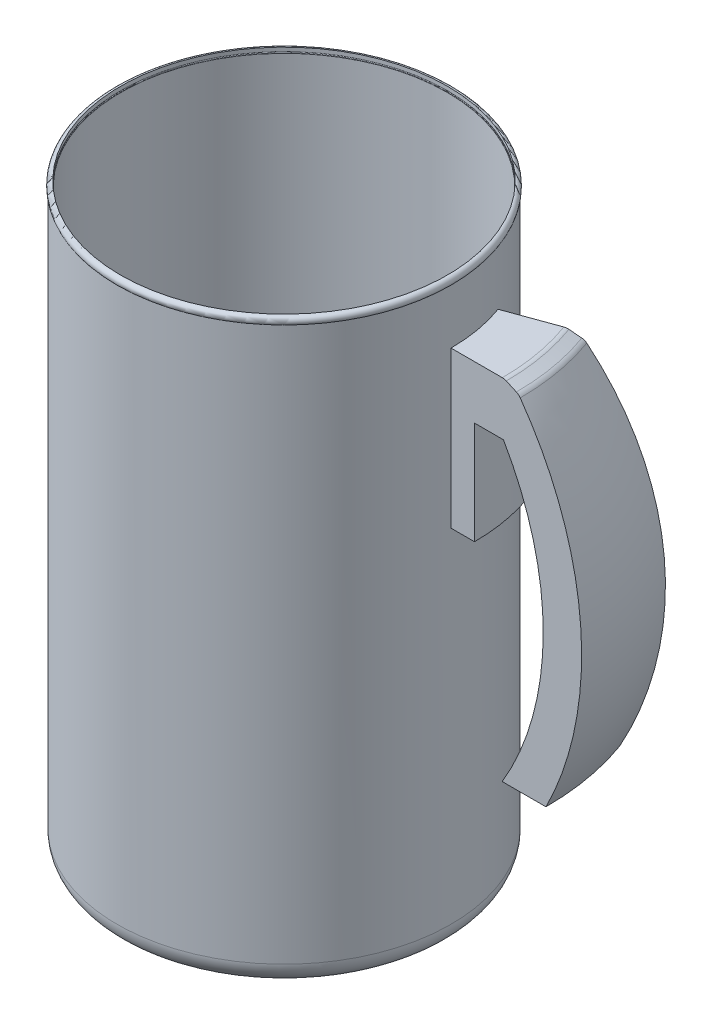
ISO-10303-21;
HEADER;
FILE_DESCRIPTION(('STEP AP214'),'2;1');
FILE_NAME('part.step','',(''),(''),'','','');
FILE_SCHEMA(('AUTOMOTIVE_DESIGN { 1 0 10303 214 1 1 1 1 }'));
ENDSEC;
DATA;
#1=APPLICATION_CONTEXT('core data for automotive mechanical design processes');
#2=APPLICATION_PROTOCOL_DEFINITION('international standard','automotive_design',2000,#1);
#3=PRODUCT_CONTEXT('',#1,'mechanical');
#4=PRODUCT('Part','Part','',(#3));
#5=PRODUCT_RELATED_PRODUCT_CATEGORY('part','',(#4));
#6=PRODUCT_DEFINITION_FORMATION('','',#4);
#7=PRODUCT_DEFINITION_CONTEXT('part definition',#1,'design');
#8=PRODUCT_DEFINITION('design','',#6,#7);
#9=PRODUCT_DEFINITION_SHAPE('','',#8);
#10=(LENGTH_UNIT() NAMED_UNIT(*) SI_UNIT(.MILLI.,.METRE.));
#11=(NAMED_UNIT(*) PLANE_ANGLE_UNIT() SI_UNIT($,.RADIAN.));
#12=(NAMED_UNIT(*) SI_UNIT($,.STERADIAN.) SOLID_ANGLE_UNIT());
#13=UNCERTAINTY_MEASURE_WITH_UNIT(LENGTH_MEASURE(1.E-05),#10,'distance_accuracy_value','');
#14=(GEOMETRIC_REPRESENTATION_CONTEXT(3) GLOBAL_UNCERTAINTY_ASSIGNED_CONTEXT((#13)) GLOBAL_UNIT_ASSIGNED_CONTEXT((#10,
#11,#12)) REPRESENTATION_CONTEXT('',''));
#15=CARTESIAN_POINT('',(0.,0.,0.));
#16=DIRECTION('',(0.,0.,1.));
#17=DIRECTION('',(1.,0.,0.));
#18=AXIS2_PLACEMENT_3D('',#15,#16,#17);
#19=CARTESIAN_POINT('',(0.,315.190892731946,0.));
#20=DIRECTION('',(0.,-1.,0.));
#21=DIRECTION('',(0.,0.,-1.));
#22=AXIS2_PLACEMENT_3D('',#19,#20,#21);
#23=CYLINDRICAL_SURFACE('',#22,85.1843540851687);
#24=CARTESIAN_POINT('',(0.,315.190892731946,0.));
#25=DIRECTION('',(0.,-1.,0.));
#26=DIRECTION('',(0.,0.,-1.));
#27=AXIS2_PLACEMENT_3D('',#24,#25,#26);
#28=CIRCLE('',#27,85.1843540851687);
#29=CARTESIAN_POINT('',(0.,315.190892731946,-85.1843540851687));
#30=VERTEX_POINT('',#29);
#31=EDGE_CURVE('E227',#30,#30,#28,.T.);
#32=ORIENTED_EDGE('',*,*,#31,.T.);
#33=EDGE_LOOP('',(#32));
#34=FACE_BOUND('',#33,.T.);
#35=CARTESIAN_POINT('',(0.,317.190892731946,0.));
#36=DIRECTION('',(0.,-1.,0.));
#37=DIRECTION('',(0.,0.,-1.));
#38=AXIS2_PLACEMENT_3D('',#35,#36,#37);
#39=CIRCLE('',#38,85.1843540851687);
#40=CARTESIAN_POINT('',(0.,317.190892731946,-85.1843540851687));
#41=VERTEX_POINT('',#40);
#42=EDGE_CURVE('E11',#41,#41,#39,.T.);
#43=ORIENTED_EDGE('',*,*,#42,.F.);
#44=EDGE_LOOP('',(#43));
#45=FACE_BOUND('',#44,.T.);
#46=ADVANCED_FACE('F38',(#34,#45),#23,.F.);
#47=CARTESIAN_POINT('',(0.,314.918573492151,0.));
#48=DIRECTION('',(0.,-1.,0.));
#49=DIRECTION('',(0.,0.,-1.));
#50=AXIS2_PLACEMENT_3D('',#47,#48,#49);
#51=TOROIDAL_SURFACE('',#50,85.1843540851687,2.27231923979454);
#52=CARTESIAN_POINT('',(0.,313.552240941307,0.));
#53=DIRECTION('',(0.,1.,0.));
#54=DIRECTION('',(0.,0.,1.));
#55=AXIS2_PLACEMENT_3D('',#52,#53,#54);
#56=CIRCLE('',#55,87.);
#57=CARTESIAN_POINT('',(0.,313.552240941307,87.));
#58=VERTEX_POINT('',#57);
#59=EDGE_CURVE('E42',#58,#58,#56,.F.);
#60=ORIENTED_EDGE('',*,*,#59,.F.);
#61=EDGE_LOOP('',(#60));
#62=FACE_BOUND('',#61,.T.);
#63=ORIENTED_EDGE('',*,*,#42,.T.);
#64=EDGE_LOOP('',(#63));
#65=FACE_BOUND('',#64,.T.);
#66=ADVANCED_FACE('F244',(#62,#65),#51,.T.);
#67=CARTESIAN_POINT('',(0.,15.1908927319458,0.));
#68=DIRECTION('',(0.,-1.,0.));
#69=DIRECTION('',(0.,0.,-1.));
#70=AXIS2_PLACEMENT_3D('',#67,#68,#69);
#71=CYLINDRICAL_SURFACE('',#70,87.);
#72=CARTESIAN_POINT('',(0.,285.165847721299,0.));
#73=DIRECTION('',(0.,-1.,0.));
#74=DIRECTION('',(0.,0.,-1.));
#75=AXIS2_PLACEMENT_3D('',#72,#73,#74);
#76=CIRCLE('',#75,87.);
#77=CARTESIAN_POINT('',(81.753258008374,285.165847721299,-29.7557524693332));
#78=VERTEX_POINT('',#77);
#79=CARTESIAN_POINT('',(87.,285.165847721299,0.));
#80=VERTEX_POINT('',#79);
#81=EDGE_CURVE('E53',#78,#80,#76,.T.);
#82=ORIENTED_EDGE('',*,*,#81,.F.);
#83=DIRECTION('',(0.,-1.,0.));
#84=VECTOR('',#83,1.);
#85=CARTESIAN_POINT('',(81.753258008374,285.165847721299,-29.7557524693332));
#86=LINE('',#85,#84);
#87=CARTESIAN_POINT('',(81.753258008374,203.913989011912,-29.7557524693332));
#88=VERTEX_POINT('',#87);
#89=EDGE_CURVE('E58',#78,#88,#86,.T.);
#90=ORIENTED_EDGE('',*,*,#89,.T.);
#91=CARTESIAN_POINT('',(0.,203.913989011912,0.));
#92=DIRECTION('',(0.,-1.,0.));
#93=DIRECTION('',(0.,0.,-1.));
#94=AXIS2_PLACEMENT_3D('',#91,#92,#93);
#95=CIRCLE('',#94,87.);
#96=CARTESIAN_POINT('',(87.,203.913989011912,0.));
#97=VERTEX_POINT('',#96);
#98=EDGE_CURVE('E117',#88,#97,#95,.T.);
#99=ORIENTED_EDGE('',*,*,#98,.T.);
#100=DIRECTION('',(0.,-1.,0.));
#101=VECTOR('',#100,1.);
#102=CARTESIAN_POINT('',(87.,285.165847721299,0.));
#103=LINE('',#102,#101);
#104=EDGE_CURVE('E122',#80,#97,#103,.T.);
#105=ORIENTED_EDGE('',*,*,#104,.F.);
#106=EDGE_LOOP('',(#82,#90,#99,#105));
#107=FACE_BOUND('',#106,.T.);
#108=CARTESIAN_POINT('',(0.,25.190892731946,0.));
#109=DIRECTION('',(0.,-1.,0.));
#110=DIRECTION('',(0.,0.,-1.));
#111=AXIS2_PLACEMENT_3D('',#108,#109,#110);
#112=CIRCLE('',#111,87.);
#113=CARTESIAN_POINT('',(0.,25.190892731946,-87.));
#114=VERTEX_POINT('',#113);
#115=EDGE_CURVE('E231',#114,#114,#112,.T.);
#116=ORIENTED_EDGE('',*,*,#115,.F.);
#117=EDGE_LOOP('',(#116));
#118=FACE_BOUND('',#117,.T.);
#119=ORIENTED_EDGE('',*,*,#59,.T.);
#120=EDGE_LOOP('',(#119));
#121=FACE_BOUND('',#120,.T.);
#122=ADVANCED_FACE('F119',(#107,#118,#121),#71,.T.);
#123=CARTESIAN_POINT('',(0.,25.190892731946,0.));
#124=DIRECTION('',(0.,-1.,0.));
#125=DIRECTION('',(0.,0.,-1.));
#126=AXIS2_PLACEMENT_3D('',#123,#124,#125);
#127=TOROIDAL_SURFACE('',#126,75.,12.);
#128=CARTESIAN_POINT('',(0.,13.190892731946,0.));
#129=DIRECTION('',(0.,-1.,0.));
#130=DIRECTION('',(0.,0.,-1.));
#131=AXIS2_PLACEMENT_3D('',#128,#129,#130);
#132=CIRCLE('',#131,75.);
#133=CARTESIAN_POINT('',(0.,13.190892731946,-75.));
#134=VERTEX_POINT('',#133);
#135=EDGE_CURVE('E230',#134,#134,#132,.T.);
#136=ORIENTED_EDGE('',*,*,#135,.F.);
#137=EDGE_LOOP('',(#136));
#138=FACE_BOUND('',#137,.T.);
#139=ORIENTED_EDGE('',*,*,#115,.T.);
#140=EDGE_LOOP('',(#139));
#141=FACE_BOUND('',#140,.T.);
#142=ADVANCED_FACE('F238',(#138,#141),#127,.T.);
#143=CARTESIAN_POINT('',(0.,13.1908927319459,0.));
#144=DIRECTION('',(0.,1.,0.));
#145=DIRECTION('',(0.,0.,1.));
#146=AXIS2_PLACEMENT_3D('',#143,#144,#145);
#147=PLANE('',#146);
#148=ORIENTED_EDGE('',*,*,#135,.T.);
#149=EDGE_LOOP('',(#148));
#150=FACE_BOUND('',#149,.T.);
#151=ADVANCED_FACE('F40',(#150),#147,.F.);
#152=CARTESIAN_POINT('',(0.,314.918573492151,0.));
#153=DIRECTION('',(0.,-1.,0.));
#154=DIRECTION('',(0.,0.,-1.));
#155=AXIS2_PLACEMENT_3D('',#152,#153,#154);
#156=TOROIDAL_SURFACE('',#155,85.1843540851687,0.272319239794538);
#157=CARTESIAN_POINT('',(0.,314.646254252357,0.));
#158=DIRECTION('',(0.,-1.,0.));
#159=DIRECTION('',(0.,0.,-1.));
#160=AXIS2_PLACEMENT_3D('',#157,#158,#159);
#161=CIRCLE('',#160,85.1843540851687);
#162=CARTESIAN_POINT('',(0.,314.646254252357,-85.1843540851687));
#163=VERTEX_POINT('',#162);
#164=EDGE_CURVE('E224',#163,#163,#161,.T.);
#165=ORIENTED_EDGE('',*,*,#164,.T.);
#166=EDGE_LOOP('',(#165));
#167=FACE_BOUND('',#166,.T.);
#168=ORIENTED_EDGE('',*,*,#31,.F.);
#169=EDGE_LOOP('',(#168));
#170=FACE_BOUND('',#169,.T.);
#171=ADVANCED_FACE('F260',(#167,#170),#156,.F.);
#172=CARTESIAN_POINT('',(-85.1655022737581,314.646254252357,0.));
#173=DIRECTION('',(0.,1.,0.));
#174=DIRECTION('',(0.,0.,1.));
#175=AXIS2_PLACEMENT_3D('',#172,#173,#174);
#176=PLANE('',#175);
#177=CARTESIAN_POINT('',(0.,314.646254252357,0.));
#178=DIRECTION('',(0.,-1.,0.));
#179=DIRECTION('',(0.,0.,-1.));
#180=AXIS2_PLACEMENT_3D('',#177,#178,#179);
#181=CIRCLE('',#180,85.1655022737581);
#182=CARTESIAN_POINT('',(0.,314.646254252357,-85.1655022737581));
#183=VERTEX_POINT('',#182);
#184=EDGE_CURVE('E221',#183,#183,#181,.T.);
#185=ORIENTED_EDGE('',*,*,#184,.T.);
#186=EDGE_LOOP('',(#185));
#187=FACE_BOUND('',#186,.T.);
#188=ORIENTED_EDGE('',*,*,#164,.F.);
#189=EDGE_LOOP('',(#188));
#190=FACE_BOUND('',#189,.T.);
#191=ADVANCED_FACE('F263',(#187,#190),#176,.T.);
#192=CARTESIAN_POINT('',(0.,314.480751978599,0.));
#193=DIRECTION('',(0.,-1.,0.));
#194=DIRECTION('',(0.,0.,-1.));
#195=AXIS2_PLACEMENT_3D('',#192,#193,#194);
#196=TOROIDAL_SURFACE('',#195,85.1655022737581,0.165502273758049);
#197=CARTESIAN_POINT('',(0.,314.480751978599,0.));
#198=DIRECTION('',(0.,-1.,0.));
#199=DIRECTION('',(0.,0.,-1.));
#200=AXIS2_PLACEMENT_3D('',#197,#198,#199);
#201=CIRCLE('',#200,85.);
#202=CARTESIAN_POINT('',(0.,314.480751978599,-85.));
#203=VERTEX_POINT('',#202);
#204=EDGE_CURVE('E218',#203,#203,#201,.T.);
#205=ORIENTED_EDGE('',*,*,#204,.T.);
#206=EDGE_LOOP('',(#205));
#207=FACE_BOUND('',#206,.T.);
#208=ORIENTED_EDGE('',*,*,#184,.F.);
#209=EDGE_LOOP('',(#208));
#210=FACE_BOUND('',#209,.T.);
#211=ADVANCED_FACE('F267',(#207,#210),#196,.T.);
#212=CARTESIAN_POINT('',(0.,15.1908927319458,0.));
#213=DIRECTION('',(0.,-1.,0.));
#214=DIRECTION('',(0.,0.,-1.));
#215=AXIS2_PLACEMENT_3D('',#212,#213,#214);
#216=CYLINDRICAL_SURFACE('',#215,85.);
#217=CARTESIAN_POINT('',(0.,25.190892731946,0.));
#218=DIRECTION('',(0.,-1.,0.));
#219=DIRECTION('',(0.,0.,-1.));
#220=AXIS2_PLACEMENT_3D('',#217,#218,#219);
#221=CIRCLE('',#220,85.);
#222=CARTESIAN_POINT('',(0.,25.190892731946,-85.));
#223=VERTEX_POINT('',#222);
#224=EDGE_CURVE('E215',#223,#223,#221,.T.);
#225=ORIENTED_EDGE('',*,*,#224,.T.);
#226=EDGE_LOOP('',(#225));
#227=FACE_BOUND('',#226,.T.);
#228=ORIENTED_EDGE('',*,*,#204,.F.);
#229=EDGE_LOOP('',(#228));
#230=FACE_BOUND('',#229,.T.);
#231=ADVANCED_FACE('F271',(#227,#230),#216,.F.);
#232=CARTESIAN_POINT('',(0.,25.190892731946,0.));
#233=DIRECTION('',(0.,-1.,0.));
#234=DIRECTION('',(0.,0.,-1.));
#235=AXIS2_PLACEMENT_3D('',#232,#233,#234);
#236=TOROIDAL_SURFACE('',#235,75.,10.);
#237=CARTESIAN_POINT('',(0.,15.190892731946,0.));
#238=DIRECTION('',(0.,-1.,0.));
#239=DIRECTION('',(0.,0.,-1.));
#240=AXIS2_PLACEMENT_3D('',#237,#238,#239);
#241=CIRCLE('',#240,75.);
#242=CARTESIAN_POINT('',(0.,15.190892731946,-75.));
#243=VERTEX_POINT('',#242);
#244=EDGE_CURVE('E212',#243,#243,#241,.T.);
#245=ORIENTED_EDGE('',*,*,#244,.T.);
#246=EDGE_LOOP('',(#245));
#247=FACE_BOUND('',#246,.T.);
#248=ORIENTED_EDGE('',*,*,#224,.F.);
#249=EDGE_LOOP('',(#248));
#250=FACE_BOUND('',#249,.T.);
#251=ADVANCED_FACE('F275',(#247,#250),#236,.F.);
#252=CARTESIAN_POINT('',(0.,15.1908927319459,0.));
#253=DIRECTION('',(0.,1.,0.));
#254=DIRECTION('',(0.,0.,1.));
#255=AXIS2_PLACEMENT_3D('',#252,#253,#254);
#256=PLANE('',#255);
#257=ORIENTED_EDGE('',*,*,#244,.F.);
#258=EDGE_LOOP('',(#257));
#259=FACE_BOUND('',#258,.T.);
#260=ADVANCED_FACE('F279',(#259),#256,.T.);
#261=CARTESIAN_POINT('',(81.753258008374,285.165847721299,-29.7557524693332));
#262=DIRECTION('',(0.,1.,0.));
#263=DIRECTION('',(0.,0.,1.));
#264=AXIS2_PLACEMENT_3D('',#261,#262,#263);
#265=PLANE('',#264);
#266=CARTESIAN_POINT('',(0.,285.165847721299,0.));
#267=DIRECTION('',(0.,-1.,0.));
#268=DIRECTION('',(0.,0.,-1.));
#269=AXIS2_PLACEMENT_3D('',#266,#267,#268);
#270=CIRCLE('',#269,113.741198074737);
#271=CARTESIAN_POINT('',(106.881764510179,285.165847721299,-38.9017808675549));
#272=VERTEX_POINT('',#271);
#273=CARTESIAN_POINT('',(113.741198074737,285.165847721299,0.));
#274=VERTEX_POINT('',#273);
#275=EDGE_CURVE('E209',#272,#274,#270,.T.);
#276=ORIENTED_EDGE('',*,*,#275,.F.);
#277=DIRECTION('',(-0.939692620785908,0.,0.342020143325669));
#278=VECTOR('',#277,1.);
#279=CARTESIAN_POINT('',(81.753258008374,285.165847721299,-29.7557524693332));
#280=LINE('',#279,#278);
#281=EDGE_CURVE('E127',#272,#78,#280,.T.);
#282=ORIENTED_EDGE('',*,*,#281,.T.);
#283=ORIENTED_EDGE('',*,*,#81,.T.);
#284=DIRECTION('',(-1.,0.,0.));
#285=VECTOR('',#284,1.);
#286=CARTESIAN_POINT('',(87.,285.165847721299,0.));
#287=LINE('',#286,#285);
#288=EDGE_CURVE('E141',#274,#80,#287,.T.);
#289=ORIENTED_EDGE('',*,*,#288,.F.);
#290=EDGE_LOOP('',(#276,#282,#283,#289));
#291=FACE_BOUND('',#290,.T.);
#292=ADVANCED_FACE('F283',(#291),#265,.T.);
#293=CARTESIAN_POINT('',(0.,280.165847721299,0.));
#294=DIRECTION('',(0.,-1.,0.));
#295=DIRECTION('',(0.,0.,-1.));
#296=AXIS2_PLACEMENT_3D('',#293,#294,#295);
#297=TOROIDAL_SURFACE('',#296,113.741198074737,5.00000000000001);
#298=CARTESIAN_POINT('',(0.,284.725455247174,0.));
#299=DIRECTION('',(0.,-1.,0.));
#300=DIRECTION('',(0.,0.,-1.));
#301=AXIS2_PLACEMENT_3D('',#298,#299,#300);
#302=CIRCLE('',#301,115.793021461381);
#303=CARTESIAN_POINT('',(108.809847805764,284.725455247174,-39.6035457963338));
#304=VERTEX_POINT('',#303);
#305=CARTESIAN_POINT('',(115.793021461381,284.725455247174,0.));
#306=VERTEX_POINT('',#305);
#307=EDGE_CURVE('E207',#304,#306,#302,.T.);
#308=ORIENTED_EDGE('',*,*,#307,.F.);
#309=CARTESIAN_POINT('',(106.881764510179,280.165847721299,-38.9017808675549));
#310=DIRECTION('',(0.342020143325669,0.,0.939692620785908));
#311=DIRECTION('',(0.939692620785908,0.,-0.342020143325669));
#312=AXIS2_PLACEMENT_3D('',#309,#310,#311);
#313=CIRCLE('',#312,5.00000000000001);
#314=EDGE_CURVE('E190',#304,#272,#313,.T.);
#315=ORIENTED_EDGE('',*,*,#314,.T.);
#316=ORIENTED_EDGE('',*,*,#275,.T.);
#317=CARTESIAN_POINT('',(113.741198074737,280.165847721299,0.));
#318=DIRECTION('',(0.,0.,1.));
#319=DIRECTION('',(1.,0.,0.));
#320=AXIS2_PLACEMENT_3D('',#317,#318,#319);
#321=CIRCLE('',#320,5.00000000000001);
#322=EDGE_CURVE('E163',#306,#274,#321,.T.);
#323=ORIENTED_EDGE('',*,*,#322,.F.);
#324=EDGE_LOOP('',(#308,#315,#316,#323));
#325=FACE_BOUND('',#324,.T.);
#326=ADVANCED_FACE('F287',(#325),#297,.T.);
#327=CARTESIAN_POINT('',(0.,282.366052011893,0.));
#328=DIRECTION('',(0.,-1.,0.));
#329=DIRECTION('',(0.,0.,-1.));
#330=AXIS2_PLACEMENT_3D('',#327,#328,#329);
#331=CONICAL_SURFACE('',#330,121.036139762005,1.14794240066195);
#332=CARTESIAN_POINT('',(0.,282.366052011893,0.));
#333=DIRECTION('',(0.,-1.,0.));
#334=DIRECTION('',(0.,0.,-1.));
#335=AXIS2_PLACEMENT_3D('',#332,#333,#334);
#336=CIRCLE('',#335,121.036139762005);
#337=CARTESIAN_POINT('',(113.736767382768,282.366052011893,-41.3967978689867));
#338=VERTEX_POINT('',#337);
#339=CARTESIAN_POINT('',(121.036139762005,282.366052011893,0.));
#340=VERTEX_POINT('',#339);
#341=EDGE_CURVE('E205',#338,#340,#336,.T.);
#342=ORIENTED_EDGE('',*,*,#341,.F.);
#343=DIRECTION('',(-0.856925909149023,0.410364677328803,0.311895523901749));
#344=VECTOR('',#343,1.);
#345=CARTESIAN_POINT('',(108.809847805764,284.725455247174,-39.6035457963338));
#346=LINE('',#345,#344);
#347=EDGE_CURVE('E187',#338,#304,#346,.T.);
#348=ORIENTED_EDGE('',*,*,#347,.T.);
#349=ORIENTED_EDGE('',*,*,#307,.T.);
#350=DIRECTION('',(-0.911921505175104,0.410364677328803,0.));
#351=VECTOR('',#350,1.);
#352=CARTESIAN_POINT('',(115.793021461381,284.725455247174,0.));
#353=LINE('',#352,#351);
#354=EDGE_CURVE('E160',#340,#306,#353,.T.);
#355=ORIENTED_EDGE('',*,*,#354,.F.);
#356=EDGE_LOOP('',(#342,#348,#349,#355));
#357=FACE_BOUND('',#356,.T.);
#358=ADVANCED_FACE('F291',(#357),#331,.T.);
#359=CARTESIAN_POINT('',(0.,277.806444486018,0.));
#360=DIRECTION('',(0.,-1.,0.));
#361=DIRECTION('',(0.,0.,-1.));
#362=AXIS2_PLACEMENT_3D('',#359,#360,#361);
#363=TOROIDAL_SURFACE('',#362,118.984316375361,5.00000000000002);
#364=CARTESIAN_POINT('',(0.,280.707686559381,0.));
#365=DIRECTION('',(0.,-1.,0.));
#366=DIRECTION('',(0.,0.,-1.));
#367=AXIS2_PLACEMENT_3D('',#364,#365,#366);
#368=CIRCLE('',#367,123.056514115126);
#369=CARTESIAN_POINT('',(115.635298253621,280.707686559381,-42.0878065948126));
#370=VERTEX_POINT('',#369);
#371=CARTESIAN_POINT('',(123.056514115126,280.707686559381,0.));
#372=VERTEX_POINT('',#371);
#373=EDGE_CURVE('E203',#370,#372,#368,.T.);
#374=ORIENTED_EDGE('',*,*,#373,.F.);
#375=CARTESIAN_POINT('',(111.808684087183,277.806444486018,-40.6950329402078));
#376=DIRECTION('',(0.342020143325669,0.,0.939692620785908));
#377=DIRECTION('',(0.939692620785908,0.,-0.342020143325669));
#378=AXIS2_PLACEMENT_3D('',#375,#376,#377);
#379=CIRCLE('',#378,5.00000000000002);
#380=EDGE_CURVE('E184',#370,#338,#379,.T.);
#381=ORIENTED_EDGE('',*,*,#380,.T.);
#382=ORIENTED_EDGE('',*,*,#341,.T.);
#383=CARTESIAN_POINT('',(118.984316375361,277.806444486018,0.));
#384=DIRECTION('',(0.,0.,1.));
#385=DIRECTION('',(1.,0.,0.));
#386=AXIS2_PLACEMENT_3D('',#383,#384,#385);
#387=CIRCLE('',#386,5.00000000000002);
#388=EDGE_CURVE('E157',#372,#340,#387,.T.);
#389=ORIENTED_EDGE('',*,*,#388,.F.);
#390=EDGE_LOOP('',(#374,#381,#382,#389));
#391=FACE_BOUND('',#390,.T.);
#392=ADVANCED_FACE('F295',(#391),#363,.T.);
#393=CARTESIAN_POINT('',(0.,180.730675604851,0.));
#394=DIRECTION('',(0.,-1.,0.));
#395=DIRECTION('',(0.,0.,-1.));
#396=AXIS2_PLACEMENT_3D('',#393,#394,#395);
#397=DEGENERATE_TOROIDAL_SURFACE('',#396,17.2717134999778,172.300360373966,.F.);
#398=CARTESIAN_POINT('',(0.,102.926705840701,0.));
#399=DIRECTION('',(0.,-1.,0.));
#400=DIRECTION('',(0.,0.,-1.));
#401=AXIS2_PLACEMENT_3D('',#398,#399,#400);
#402=CIRCLE('',#401,136.461680640456);
#403=CARTESIAN_POINT('',(128.23203431788,102.926705840701,-46.6726435711105));
#404=VERTEX_POINT('',#403);
#405=CARTESIAN_POINT('',(136.461680640456,102.926705840701,0.));
#406=VERTEX_POINT('',#405);
#407=EDGE_CURVE('E201',#404,#406,#402,.T.);
#408=ORIENTED_EDGE('',*,*,#407,.F.);
#409=CARTESIAN_POINT('',(-16.2301017242575,180.730675604851,5.90727392674232));
#410=DIRECTION('',(0.342020143325669,0.,0.939692620785908));
#411=DIRECTION('',(-0.939692620785908,0.,0.342020143325669));
#412=AXIS2_PLACEMENT_3D('',#409,#410,#411);
#413=CIRCLE('',#412,172.300360373966);
#414=EDGE_CURVE('E181',#404,#370,#413,.T.);
#415=ORIENTED_EDGE('',*,*,#414,.T.);
#416=ORIENTED_EDGE('',*,*,#373,.T.);
#417=CARTESIAN_POINT('',(-17.2717134999778,180.730675604851,0.));
#418=DIRECTION('',(0.,0.,1.));
#419=DIRECTION('',(-1.,0.,0.));
#420=AXIS2_PLACEMENT_3D('',#417,#418,#419);
#421=CIRCLE('',#420,172.300360373966);
#422=EDGE_CURVE('E154',#406,#372,#421,.T.);
#423=ORIENTED_EDGE('',*,*,#422,.F.);
#424=EDGE_LOOP('',(#408,#415,#416,#423));
#425=FACE_BOUND('',#424,.T.);
#426=ADVANCED_FACE('F299',(#425),#397,.F.);
#427=CARTESIAN_POINT('',(106.801259150781,102.926705840701,-38.8724793130353));
#428=DIRECTION('',(0.,-1.,0.));
#429=DIRECTION('',(0.,0.,-1.));
#430=AXIS2_PLACEMENT_3D('',#427,#428,#429);
#431=PLANE('',#430);
#432=CARTESIAN_POINT('',(0.,102.926705840701,0.));
#433=DIRECTION('',(0.,-1.,0.));
#434=DIRECTION('',(0.,0.,-1.));
#435=AXIS2_PLACEMENT_3D('',#432,#433,#434);
#436=CIRCLE('',#435,113.655526060701);
#437=CARTESIAN_POINT('',(106.801259150781,102.926705840701,-38.8724793130353));
#438=VERTEX_POINT('',#437);
#439=CARTESIAN_POINT('',(113.655526060701,102.926705840701,0.));
#440=VERTEX_POINT('',#439);
#441=EDGE_CURVE('E199',#438,#440,#436,.T.);
#442=ORIENTED_EDGE('',*,*,#441,.F.);
#443=DIRECTION('',(0.939692620785908,0.,-0.342020143325669));
#444=VECTOR('',#443,1.);
#445=CARTESIAN_POINT('',(106.801259150781,102.926705840701,-38.8724793130353));
#446=LINE('',#445,#444);
#447=EDGE_CURVE('E178',#438,#404,#446,.T.);
#448=ORIENTED_EDGE('',*,*,#447,.T.);
#449=ORIENTED_EDGE('',*,*,#407,.T.);
#450=DIRECTION('',(1.,0.,0.));
#451=VECTOR('',#450,1.);
#452=CARTESIAN_POINT('',(113.655526060701,102.926705840701,0.));
#453=LINE('',#452,#451);
#454=EDGE_CURVE('E151',#440,#406,#453,.T.);
#455=ORIENTED_EDGE('',*,*,#454,.F.);
#456=EDGE_LOOP('',(#442,#448,#449,#455));
#457=FACE_BOUND('',#456,.T.);
#458=ADVANCED_FACE('F303',(#457),#431,.T.);
#459=CARTESIAN_POINT('',(0.,180.730675604851,0.));
#460=DIRECTION('',(0.,-1.,0.));
#461=DIRECTION('',(0.,0.,-1.));
#462=AXIS2_PLACEMENT_3D('',#459,#460,#461);
#463=DEGENERATE_TOROIDAL_SURFACE('',#462,17.2717134999778,152.300360373966,.F.);
#464=CARTESIAN_POINT('',(0.,257.446753496334,0.));
#465=DIRECTION('',(0.,-1.,0.));
#466=DIRECTION('',(0.,0.,-1.));
#467=AXIS2_PLACEMENT_3D('',#464,#465,#466);
#468=CIRCLE('',#467,114.295923717493);
#469=CARTESIAN_POINT('',(107.403036103237,257.446753496334,-39.0915082113966));
#470=VERTEX_POINT('',#469);
#471=CARTESIAN_POINT('',(114.295923717493,257.446753496334,0.));
#472=VERTEX_POINT('',#471);
#473=EDGE_CURVE('E197',#470,#472,#468,.T.);
#474=ORIENTED_EDGE('',*,*,#473,.F.);
#475=CARTESIAN_POINT('',(-16.2301017242575,180.730675604851,5.90727392674232));
#476=DIRECTION('',(-0.342020143325669,0.,-0.939692620785908));
#477=DIRECTION('',(-0.939692620785908,0.,0.342020143325669));
#478=AXIS2_PLACEMENT_3D('',#475,#476,#477);
#479=CIRCLE('',#478,152.300360373966);
#480=EDGE_CURVE('E175',#470,#438,#479,.T.);
#481=ORIENTED_EDGE('',*,*,#480,.T.);
#482=ORIENTED_EDGE('',*,*,#441,.T.);
#483=CARTESIAN_POINT('',(-17.2717134999778,180.730675604851,0.));
#484=DIRECTION('',(0.,0.,-1.));
#485=DIRECTION('',(-1.,0.,0.));
#486=AXIS2_PLACEMENT_3D('',#483,#484,#485);
#487=CIRCLE('',#486,152.300360373966);
#488=EDGE_CURVE('E148',#472,#440,#487,.T.);
#489=ORIENTED_EDGE('',*,*,#488,.F.);
#490=EDGE_LOOP('',(#474,#481,#482,#489));
#491=FACE_BOUND('',#490,.T.);
#492=ADVANCED_FACE('F307',(#491),#463,.T.);
#493=CARTESIAN_POINT('',(93.2437575599317,257.446753496334,-33.9379522829494));
#494=DIRECTION('',(0.,-1.,0.));
#495=DIRECTION('',(0.,0.,-1.));
#496=AXIS2_PLACEMENT_3D('',#493,#494,#495);
#497=PLANE('',#496);
#498=CARTESIAN_POINT('',(0.,257.446753496334,0.));
#499=DIRECTION('',(0.,-1.,0.));
#500=DIRECTION('',(0.,0.,-1.));
#501=AXIS2_PLACEMENT_3D('',#498,#499,#500);
#502=CIRCLE('',#501,99.2279342174122);
#503=CARTESIAN_POINT('',(93.2437575599317,257.446753496334,-33.9379522829494));
#504=VERTEX_POINT('',#503);
#505=CARTESIAN_POINT('',(99.2279342174122,257.446753496334,0.));
#506=VERTEX_POINT('',#505);
#507=EDGE_CURVE('E195',#504,#506,#502,.T.);
#508=ORIENTED_EDGE('',*,*,#507,.F.);
#509=DIRECTION('',(0.939692620785908,0.,-0.342020143325669));
#510=VECTOR('',#509,1.);
#511=CARTESIAN_POINT('',(93.2437575599317,257.446753496334,-33.9379522829494));
#512=LINE('',#511,#510);
#513=EDGE_CURVE('E172',#504,#470,#512,.T.);
#514=ORIENTED_EDGE('',*,*,#513,.T.);
#515=ORIENTED_EDGE('',*,*,#473,.T.);
#516=DIRECTION('',(1.,0.,0.));
#517=VECTOR('',#516,1.);
#518=CARTESIAN_POINT('',(99.2279342174122,257.446753496334,0.));
#519=LINE('',#518,#517);
#520=EDGE_CURVE('E145',#506,#472,#519,.T.);
#521=ORIENTED_EDGE('',*,*,#520,.F.);
#522=EDGE_LOOP('',(#508,#514,#515,#521));
#523=FACE_BOUND('',#522,.T.);
#524=ADVANCED_FACE('F311',(#523),#497,.T.);
#525=CARTESIAN_POINT('',(0.,0.,0.));
#526=DIRECTION('',(0.,-1.,0.));
#527=DIRECTION('',(0.,0.,-1.));
#528=AXIS2_PLACEMENT_3D('',#525,#526,#527);
#529=CYLINDRICAL_SURFACE('',#528,99.2279342174122);
#530=CARTESIAN_POINT('',(0.,203.913989011912,0.));
#531=DIRECTION('',(0.,-1.,0.));
#532=DIRECTION('',(0.,0.,-1.));
#533=AXIS2_PLACEMENT_3D('',#530,#531,#532);
#534=CIRCLE('',#533,99.2279342174122);
#535=CARTESIAN_POINT('',(93.2437575599317,203.913989011912,-33.9379522829494));
#536=VERTEX_POINT('',#535);
#537=CARTESIAN_POINT('',(99.2279342174122,203.913989011912,0.));
#538=VERTEX_POINT('',#537);
#539=EDGE_CURVE('E126',#536,#538,#534,.T.);
#540=ORIENTED_EDGE('',*,*,#539,.F.);
#541=DIRECTION('',(0.,1.,0.));
#542=VECTOR('',#541,1.);
#543=CARTESIAN_POINT('',(93.2437575599317,203.913989011912,-33.9379522829494));
#544=LINE('',#543,#542);
#545=EDGE_CURVE('E169',#536,#504,#544,.T.);
#546=ORIENTED_EDGE('',*,*,#545,.T.);
#547=ORIENTED_EDGE('',*,*,#507,.T.);
#548=DIRECTION('',(0.,1.,0.));
#549=VECTOR('',#548,1.);
#550=CARTESIAN_POINT('',(99.2279342174122,203.913989011912,0.));
#551=LINE('',#550,#549);
#552=EDGE_CURVE('E135',#538,#506,#551,.T.);
#553=ORIENTED_EDGE('',*,*,#552,.F.);
#554=EDGE_LOOP('',(#540,#546,#547,#553));
#555=FACE_BOUND('',#554,.T.);
#556=ADVANCED_FACE('F315',(#555),#529,.T.);
#557=CARTESIAN_POINT('',(81.753258008374,203.913989011912,-29.7557524693332));
#558=DIRECTION('',(0.,-1.,0.));
#559=DIRECTION('',(0.,0.,-1.));
#560=AXIS2_PLACEMENT_3D('',#557,#558,#559);
#561=PLANE('',#560);
#562=DIRECTION('',(0.939692620785908,0.,-0.342020143325669));
#563=VECTOR('',#562,1.);
#564=CARTESIAN_POINT('',(81.753258008374,203.913989011912,-29.7557524693332));
#565=LINE('',#564,#563);
#566=EDGE_CURVE('E167',#88,#536,#565,.T.);
#567=ORIENTED_EDGE('',*,*,#566,.T.);
#568=ORIENTED_EDGE('',*,*,#539,.T.);
#569=DIRECTION('',(1.,0.,0.));
#570=VECTOR('',#569,1.);
#571=CARTESIAN_POINT('',(87.,203.913989011912,0.));
#572=LINE('',#571,#570);
#573=EDGE_CURVE('E130',#97,#538,#572,.T.);
#574=ORIENTED_EDGE('',*,*,#573,.F.);
#575=ORIENTED_EDGE('',*,*,#98,.F.);
#576=EDGE_LOOP('',(#567,#568,#574,#575));
#577=FACE_BOUND('',#576,.T.);
#578=ADVANCED_FACE('F131',(#577),#561,.T.);
#579=CARTESIAN_POINT('',(-16.2301017242575,180.730675604851,5.90727392674232));
#580=DIRECTION('',(-0.342020143325669,0.,-0.939692620785908));
#581=DIRECTION('',(-0.939692620785908,0.,0.342020143325669));
#582=AXIS2_PLACEMENT_3D('',#579,#580,#581);
#583=PLANE('',#582);
#584=ORIENTED_EDGE('',*,*,#89,.F.);
#585=ORIENTED_EDGE('',*,*,#281,.F.);
#586=ORIENTED_EDGE('',*,*,#314,.F.);
#587=ORIENTED_EDGE('',*,*,#347,.F.);
#588=ORIENTED_EDGE('',*,*,#380,.F.);
#589=ORIENTED_EDGE('',*,*,#414,.F.);
#590=ORIENTED_EDGE('',*,*,#447,.F.);
#591=ORIENTED_EDGE('',*,*,#480,.F.);
#592=ORIENTED_EDGE('',*,*,#513,.F.);
#593=ORIENTED_EDGE('',*,*,#545,.F.);
#594=ORIENTED_EDGE('',*,*,#566,.F.);
#595=EDGE_LOOP('',(#584,#585,#586,#587,#588,#589,#590,#591,#592,#593,#594));
#596=FACE_BOUND('',#595,.T.);
#597=ADVANCED_FACE('F322',(#596),#583,.T.);
#598=CARTESIAN_POINT('',(-17.2717134999778,180.730675604851,0.));
#599=DIRECTION('',(0.,0.,-1.));
#600=DIRECTION('',(-1.,0.,0.));
#601=AXIS2_PLACEMENT_3D('',#598,#599,#600);
#602=PLANE('',#601);
#603=ORIENTED_EDGE('',*,*,#104,.T.);
#604=ORIENTED_EDGE('',*,*,#573,.T.);
#605=ORIENTED_EDGE('',*,*,#552,.T.);
#606=ORIENTED_EDGE('',*,*,#520,.T.);
#607=ORIENTED_EDGE('',*,*,#488,.T.);
#608=ORIENTED_EDGE('',*,*,#454,.T.);
#609=ORIENTED_EDGE('',*,*,#422,.T.);
#610=ORIENTED_EDGE('',*,*,#388,.T.);
#611=ORIENTED_EDGE('',*,*,#354,.T.);
#612=ORIENTED_EDGE('',*,*,#322,.T.);
#613=ORIENTED_EDGE('',*,*,#288,.T.);
#614=EDGE_LOOP('',(#603,#604,#605,#606,#607,#608,#609,#610,#611,#612,#613));
#615=FACE_BOUND('',#614,.T.);
#616=ADVANCED_FACE('F138',(#615),#602,.F.);
#617=CLOSED_SHELL('',(#46,#66,#122,#142,#151,#171,#191,#211,#231,#251,#260,#292,#326,#358,#392,
#426,#458,#492,#524,#556,#578,#597,#616));
#618=MANIFOLD_SOLID_BREP('B2',#617);
#619=ADVANCED_BREP_SHAPE_REPRESENTATION('',(#18,#618),#14);
#620=SHAPE_DEFINITION_REPRESENTATION(#9,#619);
ENDSEC;
END-ISO-10303-21;
